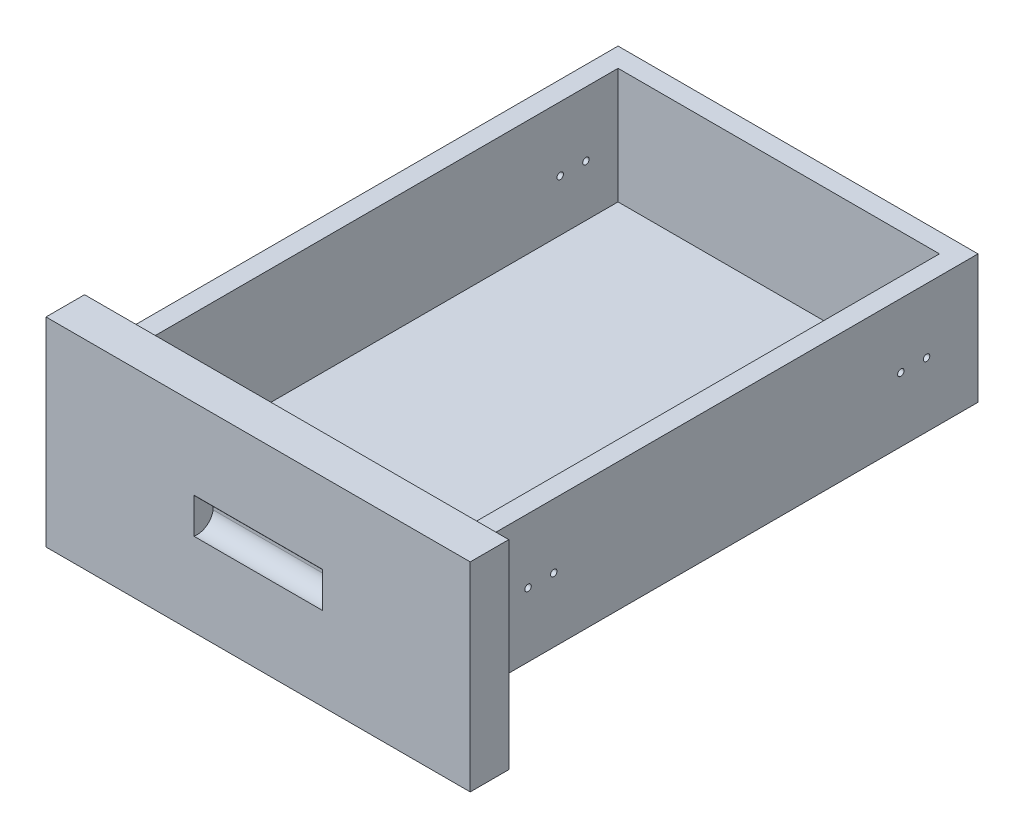
ISO-10303-21;
HEADER;
FILE_DESCRIPTION(('STEP AP214'),'2;1');
FILE_NAME('part.step','',(''),(''),'','','');
FILE_SCHEMA(('AUTOMOTIVE_DESIGN { 1 0 10303 214 1 1 1 1 }'));
ENDSEC;
DATA;
#1=APPLICATION_CONTEXT('core data for automotive mechanical design processes');
#2=APPLICATION_PROTOCOL_DEFINITION('international standard','automotive_design',2000,#1);
#3=PRODUCT_CONTEXT('',#1,'mechanical');
#4=PRODUCT('Part','Part','',(#3));
#5=PRODUCT_RELATED_PRODUCT_CATEGORY('part','',(#4));
#6=PRODUCT_DEFINITION_FORMATION('','',#4);
#7=PRODUCT_DEFINITION_CONTEXT('part definition',#1,'design');
#8=PRODUCT_DEFINITION('design','',#6,#7);
#9=PRODUCT_DEFINITION_SHAPE('','',#8);
#10=(LENGTH_UNIT() NAMED_UNIT(*) SI_UNIT(.MILLI.,.METRE.));
#11=(NAMED_UNIT(*) PLANE_ANGLE_UNIT() SI_UNIT($,.RADIAN.));
#12=(NAMED_UNIT(*) SI_UNIT($,.STERADIAN.) SOLID_ANGLE_UNIT());
#13=UNCERTAINTY_MEASURE_WITH_UNIT(LENGTH_MEASURE(1.E-05),#10,'distance_accuracy_value','');
#14=(GEOMETRIC_REPRESENTATION_CONTEXT(3) GLOBAL_UNCERTAINTY_ASSIGNED_CONTEXT((#13)) GLOBAL_UNIT_ASSIGNED_CONTEXT((#10,
#11,#12)) REPRESENTATION_CONTEXT('',''));
#15=CARTESIAN_POINT('',(0.,0.,0.));
#16=DIRECTION('',(0.,0.,1.));
#17=DIRECTION('',(1.,0.,0.));
#18=AXIS2_PLACEMENT_3D('',#15,#16,#17);
#19=CARTESIAN_POINT('',(0.,0.,0.));
#20=DIRECTION('',(0.,0.,1.));
#21=DIRECTION('',(1.,0.,0.));
#22=AXIS2_PLACEMENT_3D('',#19,#20,#21);
#23=PLANE('',#22);
#24=DIRECTION('',(0.,-1.,0.));
#25=VECTOR('',#24,1.);
#26=CARTESIAN_POINT('',(-165.,-77.5,0.));
#27=LINE('',#26,#25);
#28=CARTESIAN_POINT('',(-165.,77.5,0.));
#29=VERTEX_POINT('',#28);
#30=CARTESIAN_POINT('',(-165.,-77.5,0.));
#31=VERTEX_POINT('',#30);
#32=EDGE_CURVE('E259',#29,#31,#27,.T.);
#33=ORIENTED_EDGE('',*,*,#32,.F.);
#34=DIRECTION('',(-1.,0.,0.));
#35=VECTOR('',#34,1.);
#36=CARTESIAN_POINT('',(165.,77.5,0.));
#37=LINE('',#36,#35);
#38=CARTESIAN_POINT('',(165.,77.5,0.));
#39=VERTEX_POINT('',#38);
#40=EDGE_CURVE('E264',#39,#29,#37,.T.);
#41=ORIENTED_EDGE('',*,*,#40,.F.);
#42=DIRECTION('',(0.,1.,0.));
#43=VECTOR('',#42,1.);
#44=CARTESIAN_POINT('',(165.,-77.5,0.));
#45=LINE('',#44,#43);
#46=CARTESIAN_POINT('',(165.,-77.5,0.));
#47=VERTEX_POINT('',#46);
#48=EDGE_CURVE('E275',#47,#39,#45,.T.);
#49=ORIENTED_EDGE('',*,*,#48,.F.);
#50=DIRECTION('',(1.,0.,0.));
#51=VECTOR('',#50,1.);
#52=CARTESIAN_POINT('',(165.,-77.5,0.));
#53=LINE('',#52,#51);
#54=EDGE_CURVE('E273',#31,#47,#53,.T.);
#55=ORIENTED_EDGE('',*,*,#54,.F.);
#56=EDGE_LOOP('',(#33,#41,#49,#55));
#57=FACE_BOUND('',#56,.T.);
#58=DIRECTION('',(0.,-1.,0.));
#59=VECTOR('',#58,1.);
#60=CARTESIAN_POINT('',(140.,-37.5,0.));
#61=LINE('',#60,#59);
#62=CARTESIAN_POINT('',(140.,62.5,0.));
#63=VERTEX_POINT('',#62);
#64=CARTESIAN_POINT('',(140.,-37.5,0.));
#65=VERTEX_POINT('',#64);
#66=EDGE_CURVE('E219',#63,#65,#61,.T.);
#67=ORIENTED_EDGE('',*,*,#66,.F.);
#68=DIRECTION('',(1.,0.,0.));
#69=VECTOR('',#68,1.);
#70=CARTESIAN_POINT('',(-140.,62.5,0.));
#71=LINE('',#70,#69);
#72=CARTESIAN_POINT('',(125.,62.5,0.));
#73=VERTEX_POINT('',#72);
#74=EDGE_CURVE('E245',#73,#63,#71,.T.);
#75=ORIENTED_EDGE('',*,*,#74,.F.);
#76=DIRECTION('',(0.,1.,0.));
#77=VECTOR('',#76,1.);
#78=CARTESIAN_POINT('',(125.,-27.5,0.));
#79=LINE('',#78,#77);
#80=CARTESIAN_POINT('',(125.,-27.5,0.));
#81=VERTEX_POINT('',#80);
#82=EDGE_CURVE('E222',#81,#73,#79,.T.);
#83=ORIENTED_EDGE('',*,*,#82,.F.);
#84=DIRECTION('',(1.,0.,0.));
#85=VECTOR('',#84,1.);
#86=CARTESIAN_POINT('',(-125.,-27.5,0.));
#87=LINE('',#86,#85);
#88=CARTESIAN_POINT('',(-125.,-27.5,0.));
#89=VERTEX_POINT('',#88);
#90=EDGE_CURVE('E200',#89,#81,#87,.T.);
#91=ORIENTED_EDGE('',*,*,#90,.F.);
#92=DIRECTION('',(0.,1.,0.));
#93=VECTOR('',#92,1.);
#94=CARTESIAN_POINT('',(-125.,-27.5,0.));
#95=LINE('',#94,#93);
#96=CARTESIAN_POINT('',(-125.,62.5,0.));
#97=VERTEX_POINT('',#96);
#98=EDGE_CURVE('E210',#89,#97,#95,.T.);
#99=ORIENTED_EDGE('',*,*,#98,.T.);
#100=CARTESIAN_POINT('',(-140.,62.5,0.));
#101=VERTEX_POINT('',#100);
#102=EDGE_CURVE('E230',#101,#97,#71,.T.);
#103=ORIENTED_EDGE('',*,*,#102,.F.);
#104=DIRECTION('',(0.,1.,0.));
#105=VECTOR('',#104,1.);
#106=CARTESIAN_POINT('',(-140.,-37.5,0.));
#107=LINE('',#106,#105);
#108=CARTESIAN_POINT('',(-140.,-37.5,0.));
#109=VERTEX_POINT('',#108);
#110=EDGE_CURVE('E242',#109,#101,#107,.T.);
#111=ORIENTED_EDGE('',*,*,#110,.F.);
#112=DIRECTION('',(-1.,0.,0.));
#113=VECTOR('',#112,1.);
#114=CARTESIAN_POINT('',(-140.,-37.5,0.));
#115=LINE('',#114,#113);
#116=EDGE_CURVE('E239',#65,#109,#115,.T.);
#117=ORIENTED_EDGE('',*,*,#116,.F.);
#118=EDGE_LOOP('',(#67,#75,#83,#91,#99,#103,#111,#117));
#119=FACE_BOUND('',#118,.T.);
#120=ADVANCED_FACE('F34',(#57,#119),#23,.F.);
#121=CARTESIAN_POINT('',(-165.,-77.5,30.));
#122=DIRECTION('',(1.,0.,0.));
#123=DIRECTION('',(0.,0.,-1.));
#124=AXIS2_PLACEMENT_3D('',#121,#122,#123);
#125=PLANE('',#124);
#126=ORIENTED_EDGE('',*,*,#32,.T.);
#127=DIRECTION('',(0.,0.,-1.));
#128=VECTOR('',#127,1.);
#129=CARTESIAN_POINT('',(-165.,-77.5,30.));
#130=LINE('',#129,#128);
#131=CARTESIAN_POINT('',(-165.,-77.5,30.));
#132=VERTEX_POINT('',#131);
#133=EDGE_CURVE('E286',#132,#31,#130,.T.);
#134=ORIENTED_EDGE('',*,*,#133,.F.);
#135=DIRECTION('',(0.,-1.,0.));
#136=VECTOR('',#135,1.);
#137=CARTESIAN_POINT('',(-165.,-77.5,30.));
#138=LINE('',#137,#136);
#139=CARTESIAN_POINT('',(-165.,77.5,30.));
#140=VERTEX_POINT('',#139);
#141=EDGE_CURVE('E260',#140,#132,#138,.T.);
#142=ORIENTED_EDGE('',*,*,#141,.F.);
#143=DIRECTION('',(0.,0.,-1.));
#144=VECTOR('',#143,1.);
#145=CARTESIAN_POINT('',(-165.,77.5,30.));
#146=LINE('',#145,#144);
#147=EDGE_CURVE('E270',#140,#29,#146,.T.);
#148=ORIENTED_EDGE('',*,*,#147,.T.);
#149=EDGE_LOOP('',(#126,#134,#142,#148));
#150=FACE_BOUND('',#149,.T.);
#151=ADVANCED_FACE('F364',(#150),#125,.F.);
#152=CARTESIAN_POINT('',(165.,-77.5,30.));
#153=DIRECTION('',(0.,1.,0.));
#154=DIRECTION('',(-1.,0.,0.));
#155=AXIS2_PLACEMENT_3D('',#152,#153,#154);
#156=PLANE('',#155);
#157=ORIENTED_EDGE('',*,*,#54,.T.);
#158=DIRECTION('',(0.,0.,-1.));
#159=VECTOR('',#158,1.);
#160=CARTESIAN_POINT('',(165.,-77.5,30.));
#161=LINE('',#160,#159);
#162=CARTESIAN_POINT('',(165.,-77.5,30.));
#163=VERTEX_POINT('',#162);
#164=EDGE_CURVE('E283',#163,#47,#161,.T.);
#165=ORIENTED_EDGE('',*,*,#164,.F.);
#166=DIRECTION('',(1.,0.,0.));
#167=VECTOR('',#166,1.);
#168=CARTESIAN_POINT('',(165.,-77.5,30.));
#169=LINE('',#168,#167);
#170=EDGE_CURVE('E263',#132,#163,#169,.T.);
#171=ORIENTED_EDGE('',*,*,#170,.F.);
#172=ORIENTED_EDGE('',*,*,#133,.T.);
#173=EDGE_LOOP('',(#157,#165,#171,#172));
#174=FACE_BOUND('',#173,.T.);
#175=ADVANCED_FACE('F370',(#174),#156,.F.);
#176=CARTESIAN_POINT('',(165.,-77.5,30.));
#177=DIRECTION('',(-1.,0.,0.));
#178=DIRECTION('',(0.,0.,1.));
#179=AXIS2_PLACEMENT_3D('',#176,#177,#178);
#180=PLANE('',#179);
#181=ORIENTED_EDGE('',*,*,#48,.T.);
#182=DIRECTION('',(0.,0.,-1.));
#183=VECTOR('',#182,1.);
#184=CARTESIAN_POINT('',(165.,77.5,30.));
#185=LINE('',#184,#183);
#186=CARTESIAN_POINT('',(165.,77.5,30.));
#187=VERTEX_POINT('',#186);
#188=EDGE_CURVE('E280',#187,#39,#185,.T.);
#189=ORIENTED_EDGE('',*,*,#188,.F.);
#190=DIRECTION('',(0.,1.,0.));
#191=VECTOR('',#190,1.);
#192=CARTESIAN_POINT('',(165.,-77.5,30.));
#193=LINE('',#192,#191);
#194=EDGE_CURVE('E266',#163,#187,#193,.T.);
#195=ORIENTED_EDGE('',*,*,#194,.F.);
#196=ORIENTED_EDGE('',*,*,#164,.T.);
#197=EDGE_LOOP('',(#181,#189,#195,#196));
#198=FACE_BOUND('',#197,.T.);
#199=ADVANCED_FACE('F380',(#198),#180,.F.);
#200=CARTESIAN_POINT('',(165.,77.5,30.));
#201=DIRECTION('',(0.,-1.,0.));
#202=DIRECTION('',(1.,0.,0.));
#203=AXIS2_PLACEMENT_3D('',#200,#201,#202);
#204=PLANE('',#203);
#205=ORIENTED_EDGE('',*,*,#40,.T.);
#206=ORIENTED_EDGE('',*,*,#147,.F.);
#207=DIRECTION('',(-1.,0.,0.));
#208=VECTOR('',#207,1.);
#209=CARTESIAN_POINT('',(165.,77.5,30.));
#210=LINE('',#209,#208);
#211=EDGE_CURVE('E268',#187,#140,#210,.T.);
#212=ORIENTED_EDGE('',*,*,#211,.F.);
#213=ORIENTED_EDGE('',*,*,#188,.T.);
#214=EDGE_LOOP('',(#205,#206,#212,#213));
#215=FACE_BOUND('',#214,.T.);
#216=ADVANCED_FACE('F377',(#215),#204,.F.);
#217=CARTESIAN_POINT('',(0.,0.,30.));
#218=DIRECTION('',(0.,0.,1.));
#219=DIRECTION('',(1.,0.,0.));
#220=AXIS2_PLACEMENT_3D('',#217,#218,#219);
#221=PLANE('',#220);
#222=DIRECTION('',(1.,0.,0.));
#223=VECTOR('',#222,1.);
#224=CARTESIAN_POINT('',(0.,15.0778477436762,30.));
#225=LINE('',#224,#223);
#226=CARTESIAN_POINT('',(-50.,15.0778477436762,30.));
#227=VERTEX_POINT('',#226);
#228=CARTESIAN_POINT('',(50.,15.0778477436762,30.));
#229=VERTEX_POINT('',#228);
#230=EDGE_CURVE('E297',#227,#229,#225,.T.);
#231=ORIENTED_EDGE('',*,*,#230,.T.);
#232=DIRECTION('',(0.,-1.,0.));
#233=VECTOR('',#232,1.);
#234=CARTESIAN_POINT('',(50.,0.,30.));
#235=LINE('',#234,#233);
#236=CARTESIAN_POINT('',(50.,-12.6984706511995,30.));
#237=VERTEX_POINT('',#236);
#238=EDGE_CURVE('E289',#229,#237,#235,.T.);
#239=ORIENTED_EDGE('',*,*,#238,.T.);
#240=DIRECTION('',(1.,0.,0.));
#241=VECTOR('',#240,1.);
#242=CARTESIAN_POINT('',(-50.,-12.6984706511995,30.));
#243=LINE('',#242,#241);
#244=CARTESIAN_POINT('',(-50.,-12.6984706511995,30.));
#245=VERTEX_POINT('',#244);
#246=EDGE_CURVE('E292',#237,#245,#243,.F.);
#247=ORIENTED_EDGE('',*,*,#246,.T.);
#248=DIRECTION('',(0.,-1.,0.));
#249=VECTOR('',#248,1.);
#250=CARTESIAN_POINT('',(-50.,0.,30.));
#251=LINE('',#250,#249);
#252=EDGE_CURVE('E295',#227,#245,#251,.T.);
#253=ORIENTED_EDGE('',*,*,#252,.F.);
#254=EDGE_LOOP('',(#231,#239,#247,#253));
#255=FACE_BOUND('',#254,.T.);
#256=ORIENTED_EDGE('',*,*,#141,.T.);
#257=ORIENTED_EDGE('',*,*,#170,.T.);
#258=ORIENTED_EDGE('',*,*,#194,.T.);
#259=ORIENTED_EDGE('',*,*,#211,.T.);
#260=EDGE_LOOP('',(#256,#257,#258,#259));
#261=FACE_BOUND('',#260,.T.);
#262=ADVANCED_FACE('F348',(#255,#261),#221,.T.);
#263=CARTESIAN_POINT('',(140.,-37.5,-390.));
#264=DIRECTION('',(-1.,0.,0.));
#265=DIRECTION('',(0.,0.,1.));
#266=AXIS2_PLACEMENT_3D('',#263,#264,#265);
#267=PLANE('',#266);
#268=CARTESIAN_POINT('',(140.,12.5,-330.));
#269=DIRECTION('',(1.,0.,0.));
#270=DIRECTION('',(0.,0.,-1.));
#271=AXIS2_PLACEMENT_3D('',#268,#269,#270);
#272=CIRCLE('',#271,2.50000000000002);
#273=CARTESIAN_POINT('',(140.,12.5,-332.5));
#274=VERTEX_POINT('',#273);
#275=EDGE_CURVE('E310',#274,#274,#272,.T.);
#276=ORIENTED_EDGE('',*,*,#275,.F.);
#277=EDGE_LOOP('',(#276));
#278=FACE_BOUND('',#277,.T.);
#279=CARTESIAN_POINT('',(140.,12.5,-60.));
#280=DIRECTION('',(1.,0.,0.));
#281=DIRECTION('',(0.,0.,1.));
#282=AXIS2_PLACEMENT_3D('',#279,#280,#281);
#283=CIRCLE('',#282,2.50000000000002);
#284=CARTESIAN_POINT('',(140.,12.5,-57.5));
#285=VERTEX_POINT('',#284);
#286=EDGE_CURVE('E517',#285,#285,#283,.T.);
#287=ORIENTED_EDGE('',*,*,#286,.F.);
#288=EDGE_LOOP('',(#287));
#289=FACE_BOUND('',#288,.T.);
#290=CARTESIAN_POINT('',(140.,12.5,-40.));
#291=DIRECTION('',(1.,0.,0.));
#292=DIRECTION('',(0.,0.,1.));
#293=AXIS2_PLACEMENT_3D('',#290,#291,#292);
#294=CIRCLE('',#293,2.50000000000002);
#295=CARTESIAN_POINT('',(140.,12.5,-37.5));
#296=VERTEX_POINT('',#295);
#297=EDGE_CURVE('E515',#296,#296,#294,.T.);
#298=ORIENTED_EDGE('',*,*,#297,.F.);
#299=EDGE_LOOP('',(#298));
#300=FACE_BOUND('',#299,.T.);
#301=CARTESIAN_POINT('',(140.,12.5,-350.));
#302=DIRECTION('',(1.,0.,0.));
#303=DIRECTION('',(0.,0.,-1.));
#304=AXIS2_PLACEMENT_3D('',#301,#302,#303);
#305=CIRCLE('',#304,2.50000000000002);
#306=CARTESIAN_POINT('',(140.,12.5,-352.5));
#307=VERTEX_POINT('',#306);
#308=EDGE_CURVE('E306',#307,#307,#305,.T.);
#309=ORIENTED_EDGE('',*,*,#308,.F.);
#310=EDGE_LOOP('',(#309));
#311=FACE_BOUND('',#310,.T.);
#312=ORIENTED_EDGE('',*,*,#66,.T.);
#313=DIRECTION('',(0.,0.,1.));
#314=VECTOR('',#313,1.);
#315=CARTESIAN_POINT('',(140.,-37.5,-390.));
#316=LINE('',#315,#314);
#317=CARTESIAN_POINT('',(140.,-37.5,-390.));
#318=VERTEX_POINT('',#317);
#319=EDGE_CURVE('E256',#318,#65,#316,.T.);
#320=ORIENTED_EDGE('',*,*,#319,.F.);
#321=DIRECTION('',(0.,-1.,0.));
#322=VECTOR('',#321,1.);
#323=CARTESIAN_POINT('',(140.,-37.5,-390.));
#324=LINE('',#323,#322);
#325=CARTESIAN_POINT('',(140.,62.5,-390.));
#326=VERTEX_POINT('',#325);
#327=EDGE_CURVE('E226',#326,#318,#324,.T.);
#328=ORIENTED_EDGE('',*,*,#327,.F.);
#329=DIRECTION('',(0.,0.,1.));
#330=VECTOR('',#329,1.);
#331=CARTESIAN_POINT('',(140.,62.5,-390.));
#332=LINE('',#331,#330);
#333=EDGE_CURVE('E236',#326,#63,#332,.T.);
#334=ORIENTED_EDGE('',*,*,#333,.T.);
#335=EDGE_LOOP('',(#312,#320,#328,#334));
#336=FACE_BOUND('',#335,.T.);
#337=ADVANCED_FACE('F399',(#278,#289,#300,#311,#336),#267,.F.);
#338=CARTESIAN_POINT('',(-140.,-37.5,-390.));
#339=DIRECTION('',(0.,1.,0.));
#340=DIRECTION('',(0.,0.,1.));
#341=AXIS2_PLACEMENT_3D('',#338,#339,#340);
#342=PLANE('',#341);
#343=ORIENTED_EDGE('',*,*,#116,.T.);
#344=DIRECTION('',(0.,0.,1.));
#345=VECTOR('',#344,1.);
#346=CARTESIAN_POINT('',(-140.,-37.5,-390.));
#347=LINE('',#346,#345);
#348=CARTESIAN_POINT('',(-140.,-37.5,-390.));
#349=VERTEX_POINT('',#348);
#350=EDGE_CURVE('E253',#349,#109,#347,.T.);
#351=ORIENTED_EDGE('',*,*,#350,.F.);
#352=DIRECTION('',(-1.,0.,0.));
#353=VECTOR('',#352,1.);
#354=CARTESIAN_POINT('',(-140.,-37.5,-390.));
#355=LINE('',#354,#353);
#356=EDGE_CURVE('E229',#318,#349,#355,.T.);
#357=ORIENTED_EDGE('',*,*,#356,.F.);
#358=ORIENTED_EDGE('',*,*,#319,.T.);
#359=EDGE_LOOP('',(#343,#351,#357,#358));
#360=FACE_BOUND('',#359,.T.);
#361=ADVANCED_FACE('F403',(#360),#342,.F.);
#362=CARTESIAN_POINT('',(-140.,-37.5,-390.));
#363=DIRECTION('',(1.,0.,0.));
#364=DIRECTION('',(0.,0.,-1.));
#365=AXIS2_PLACEMENT_3D('',#362,#363,#364);
#366=PLANE('',#365);
#367=CARTESIAN_POINT('',(-140.,12.5,-330.));
#368=DIRECTION('',(1.,0.,0.));
#369=DIRECTION('',(0.,0.,-1.));
#370=AXIS2_PLACEMENT_3D('',#367,#368,#369);
#371=CIRCLE('',#370,2.50000000000002);
#372=CARTESIAN_POINT('',(-140.,12.5,-332.5));
#373=VERTEX_POINT('',#372);
#374=EDGE_CURVE('E333',#373,#373,#371,.T.);
#375=ORIENTED_EDGE('',*,*,#374,.T.);
#376=EDGE_LOOP('',(#375));
#377=FACE_BOUND('',#376,.T.);
#378=CARTESIAN_POINT('',(-140.,12.5,-60.));
#379=DIRECTION('',(1.,0.,0.));
#380=DIRECTION('',(0.,0.,-1.));
#381=AXIS2_PLACEMENT_3D('',#378,#379,#380);
#382=CIRCLE('',#381,2.50000000000002);
#383=CARTESIAN_POINT('',(-140.,12.5,-62.5));
#384=VERTEX_POINT('',#383);
#385=EDGE_CURVE('E318',#384,#384,#382,.T.);
#386=ORIENTED_EDGE('',*,*,#385,.T.);
#387=EDGE_LOOP('',(#386));
#388=FACE_BOUND('',#387,.T.);
#389=CARTESIAN_POINT('',(-140.,12.5,-40.));
#390=DIRECTION('',(1.,0.,0.));
#391=DIRECTION('',(0.,0.,-1.));
#392=AXIS2_PLACEMENT_3D('',#389,#390,#391);
#393=CIRCLE('',#392,2.50000000000002);
#394=CARTESIAN_POINT('',(-140.,12.5,-42.5));
#395=VERTEX_POINT('',#394);
#396=EDGE_CURVE('E314',#395,#395,#393,.T.);
#397=ORIENTED_EDGE('',*,*,#396,.T.);
#398=EDGE_LOOP('',(#397));
#399=FACE_BOUND('',#398,.T.);
#400=CARTESIAN_POINT('',(-140.,12.5,-350.));
#401=DIRECTION('',(1.,0.,0.));
#402=DIRECTION('',(0.,0.,-1.));
#403=AXIS2_PLACEMENT_3D('',#400,#401,#402);
#404=CIRCLE('',#403,2.50000000000002);
#405=CARTESIAN_POINT('',(-140.,12.5,-352.5));
#406=VERTEX_POINT('',#405);
#407=EDGE_CURVE('E189',#406,#406,#404,.T.);
#408=ORIENTED_EDGE('',*,*,#407,.T.);
#409=EDGE_LOOP('',(#408));
#410=FACE_BOUND('',#409,.T.);
#411=ORIENTED_EDGE('',*,*,#110,.T.);
#412=DIRECTION('',(0.,0.,1.));
#413=VECTOR('',#412,1.);
#414=CARTESIAN_POINT('',(-140.,62.5,-390.));
#415=LINE('',#414,#413);
#416=CARTESIAN_POINT('',(-140.,62.5,-390.));
#417=VERTEX_POINT('',#416);
#418=EDGE_CURVE('E250',#417,#101,#415,.T.);
#419=ORIENTED_EDGE('',*,*,#418,.F.);
#420=DIRECTION('',(0.,1.,0.));
#421=VECTOR('',#420,1.);
#422=CARTESIAN_POINT('',(-140.,-37.5,-390.));
#423=LINE('',#422,#421);
#424=EDGE_CURVE('E232',#349,#417,#423,.T.);
#425=ORIENTED_EDGE('',*,*,#424,.F.);
#426=ORIENTED_EDGE('',*,*,#350,.T.);
#427=EDGE_LOOP('',(#411,#419,#425,#426));
#428=FACE_BOUND('',#427,.T.);
#429=ADVANCED_FACE('F408',(#377,#388,#399,#410,#428),#366,.F.);
#430=CARTESIAN_POINT('',(-140.,62.5,-390.));
#431=DIRECTION('',(0.,-1.,0.));
#432=DIRECTION('',(0.,0.,-1.));
#433=AXIS2_PLACEMENT_3D('',#430,#431,#432);
#434=PLANE('',#433);
#435=ORIENTED_EDGE('',*,*,#102,.T.);
#436=DIRECTION('',(0.,0.,1.));
#437=VECTOR('',#436,1.);
#438=CARTESIAN_POINT('',(-125.,62.5,0.));
#439=LINE('',#438,#437);
#440=CARTESIAN_POINT('',(-125.,62.5,-375.));
#441=VERTEX_POINT('',#440);
#442=EDGE_CURVE('E174',#441,#97,#439,.T.);
#443=ORIENTED_EDGE('',*,*,#442,.F.);
#444=DIRECTION('',(-1.,0.,0.));
#445=VECTOR('',#444,1.);
#446=CARTESIAN_POINT('',(-125.,62.5,-375.));
#447=LINE('',#446,#445);
#448=CARTESIAN_POINT('',(125.,62.5,-375.));
#449=VERTEX_POINT('',#448);
#450=EDGE_CURVE('E201',#449,#441,#447,.T.);
#451=ORIENTED_EDGE('',*,*,#450,.F.);
#452=DIRECTION('',(0.,0.,-1.));
#453=VECTOR('',#452,1.);
#454=CARTESIAN_POINT('',(125.,62.5,0.));
#455=LINE('',#454,#453);
#456=EDGE_CURVE('E212',#73,#449,#455,.T.);
#457=ORIENTED_EDGE('',*,*,#456,.F.);
#458=ORIENTED_EDGE('',*,*,#74,.T.);
#459=ORIENTED_EDGE('',*,*,#333,.F.);
#460=DIRECTION('',(1.,0.,0.));
#461=VECTOR('',#460,1.);
#462=CARTESIAN_POINT('',(-140.,62.5,-390.));
#463=LINE('',#462,#461);
#464=EDGE_CURVE('E234',#417,#326,#463,.T.);
#465=ORIENTED_EDGE('',*,*,#464,.F.);
#466=ORIENTED_EDGE('',*,*,#418,.T.);
#467=EDGE_LOOP('',(#435,#443,#451,#457,#458,#459,#465,#466));
#468=FACE_BOUND('',#467,.T.);
#469=ADVANCED_FACE('F416',(#468),#434,.F.);
#470=CARTESIAN_POINT('',(0.,0.,-390.));
#471=DIRECTION('',(0.,0.,-1.));
#472=DIRECTION('',(-1.,0.,0.));
#473=AXIS2_PLACEMENT_3D('',#470,#471,#472);
#474=PLANE('',#473);
#475=ORIENTED_EDGE('',*,*,#327,.T.);
#476=ORIENTED_EDGE('',*,*,#356,.T.);
#477=ORIENTED_EDGE('',*,*,#424,.T.);
#478=ORIENTED_EDGE('',*,*,#464,.T.);
#479=EDGE_LOOP('',(#475,#476,#477,#478));
#480=FACE_BOUND('',#479,.T.);
#481=ADVANCED_FACE('F420',(#480),#474,.T.);
#482=CARTESIAN_POINT('',(-125.,-27.5,0.));
#483=DIRECTION('',(-1.,0.,0.));
#484=DIRECTION('',(0.,0.,1.));
#485=AXIS2_PLACEMENT_3D('',#482,#483,#484);
#486=PLANE('',#485);
#487=CARTESIAN_POINT('',(-125.,12.5,-330.));
#488=DIRECTION('',(-1.,0.,0.));
#489=DIRECTION('',(0.,0.,1.));
#490=AXIS2_PLACEMENT_3D('',#487,#488,#489);
#491=CIRCLE('',#490,2.50000000000002);
#492=CARTESIAN_POINT('',(-125.,12.5,-327.5));
#493=VERTEX_POINT('',#492);
#494=EDGE_CURVE('E330',#493,#493,#491,.T.);
#495=ORIENTED_EDGE('',*,*,#494,.T.);
#496=EDGE_LOOP('',(#495));
#497=FACE_BOUND('',#496,.T.);
#498=CARTESIAN_POINT('',(-125.,12.5,-60.));
#499=DIRECTION('',(-1.,0.,0.));
#500=DIRECTION('',(0.,0.,1.));
#501=AXIS2_PLACEMENT_3D('',#498,#499,#500);
#502=CIRCLE('',#501,2.50000000000002);
#503=CARTESIAN_POINT('',(-125.,12.5,-57.5));
#504=VERTEX_POINT('',#503);
#505=EDGE_CURVE('E313',#504,#504,#502,.T.);
#506=ORIENTED_EDGE('',*,*,#505,.T.);
#507=EDGE_LOOP('',(#506));
#508=FACE_BOUND('',#507,.T.);
#509=CARTESIAN_POINT('',(-125.,12.5,-40.));
#510=DIRECTION('',(-1.,0.,0.));
#511=DIRECTION('',(0.,0.,1.));
#512=AXIS2_PLACEMENT_3D('',#509,#510,#511);
#513=CIRCLE('',#512,2.50000000000002);
#514=CARTESIAN_POINT('',(-125.,12.5,-37.5));
#515=VERTEX_POINT('',#514);
#516=EDGE_CURVE('E309',#515,#515,#513,.T.);
#517=ORIENTED_EDGE('',*,*,#516,.T.);
#518=EDGE_LOOP('',(#517));
#519=FACE_BOUND('',#518,.T.);
#520=CARTESIAN_POINT('',(-125.,12.5,-350.));
#521=DIRECTION('',(-1.,0.,0.));
#522=DIRECTION('',(0.,0.,1.));
#523=AXIS2_PLACEMENT_3D('',#520,#521,#522);
#524=CIRCLE('',#523,2.50000000000002);
#525=CARTESIAN_POINT('',(-125.,12.5,-347.5));
#526=VERTEX_POINT('',#525);
#527=EDGE_CURVE('E305',#526,#526,#524,.T.);
#528=ORIENTED_EDGE('',*,*,#527,.T.);
#529=EDGE_LOOP('',(#528));
#530=FACE_BOUND('',#529,.T.);
#531=ORIENTED_EDGE('',*,*,#442,.T.);
#532=ORIENTED_EDGE('',*,*,#98,.F.);
#533=DIRECTION('',(0.,0.,1.));
#534=VECTOR('',#533,1.);
#535=CARTESIAN_POINT('',(-125.,-27.5,0.));
#536=LINE('',#535,#534);
#537=CARTESIAN_POINT('',(-125.,-27.5,-375.));
#538=VERTEX_POINT('',#537);
#539=EDGE_CURVE('E197',#538,#89,#536,.T.);
#540=ORIENTED_EDGE('',*,*,#539,.F.);
#541=DIRECTION('',(0.,1.,0.));
#542=VECTOR('',#541,1.);
#543=CARTESIAN_POINT('',(-125.,-27.5,-375.));
#544=LINE('',#543,#542);
#545=EDGE_CURVE('E217',#538,#441,#544,.T.);
#546=ORIENTED_EDGE('',*,*,#545,.T.);
#547=EDGE_LOOP('',(#531,#532,#540,#546));
#548=FACE_BOUND('',#547,.T.);
#549=ADVANCED_FACE('F424',(#497,#508,#519,#530,#548),#486,.F.);
#550=CARTESIAN_POINT('',(-125.,-27.5,-375.));
#551=DIRECTION('',(0.,0.,-1.));
#552=DIRECTION('',(-1.,0.,0.));
#553=AXIS2_PLACEMENT_3D('',#550,#551,#552);
#554=PLANE('',#553);
#555=ORIENTED_EDGE('',*,*,#450,.T.);
#556=ORIENTED_EDGE('',*,*,#545,.F.);
#557=DIRECTION('',(-1.,0.,0.));
#558=VECTOR('',#557,1.);
#559=CARTESIAN_POINT('',(-125.,-27.5,-375.));
#560=LINE('',#559,#558);
#561=CARTESIAN_POINT('',(125.,-27.5,-375.));
#562=VERTEX_POINT('',#561);
#563=EDGE_CURVE('E207',#562,#538,#560,.T.);
#564=ORIENTED_EDGE('',*,*,#563,.F.);
#565=DIRECTION('',(0.,1.,0.));
#566=VECTOR('',#565,1.);
#567=CARTESIAN_POINT('',(125.,-27.5,-375.));
#568=LINE('',#567,#566);
#569=EDGE_CURVE('E220',#562,#449,#568,.T.);
#570=ORIENTED_EDGE('',*,*,#569,.T.);
#571=EDGE_LOOP('',(#555,#556,#564,#570));
#572=FACE_BOUND('',#571,.T.);
#573=ADVANCED_FACE('F428',(#572),#554,.F.);
#574=CARTESIAN_POINT('',(125.,-27.5,0.));
#575=DIRECTION('',(1.,0.,0.));
#576=DIRECTION('',(0.,0.,-1.));
#577=AXIS2_PLACEMENT_3D('',#574,#575,#576);
#578=PLANE('',#577);
#579=CARTESIAN_POINT('',(125.,12.5,-330.));
#580=DIRECTION('',(1.,0.,0.));
#581=DIRECTION('',(0.,0.,-1.));
#582=AXIS2_PLACEMENT_3D('',#579,#580,#581);
#583=CIRCLE('',#582,2.50000000000002);
#584=CARTESIAN_POINT('',(125.,12.5,-332.5));
#585=VERTEX_POINT('',#584);
#586=EDGE_CURVE('E38',#585,#585,#583,.T.);
#587=ORIENTED_EDGE('',*,*,#586,.T.);
#588=EDGE_LOOP('',(#587));
#589=FACE_BOUND('',#588,.T.);
#590=CARTESIAN_POINT('',(125.,12.5,-60.));
#591=DIRECTION('',(1.,0.,0.));
#592=DIRECTION('',(0.,0.,-1.));
#593=AXIS2_PLACEMENT_3D('',#590,#591,#592);
#594=CIRCLE('',#593,2.50000000000002);
#595=CARTESIAN_POINT('',(125.,12.5,-62.5));
#596=VERTEX_POINT('',#595);
#597=EDGE_CURVE('E311',#596,#596,#594,.T.);
#598=ORIENTED_EDGE('',*,*,#597,.T.);
#599=EDGE_LOOP('',(#598));
#600=FACE_BOUND('',#599,.T.);
#601=CARTESIAN_POINT('',(125.,12.5,-40.));
#602=DIRECTION('',(1.,0.,0.));
#603=DIRECTION('',(0.,0.,-1.));
#604=AXIS2_PLACEMENT_3D('',#601,#602,#603);
#605=CIRCLE('',#604,2.50000000000002);
#606=CARTESIAN_POINT('',(125.,12.5,-42.5));
#607=VERTEX_POINT('',#606);
#608=EDGE_CURVE('E307',#607,#607,#605,.T.);
#609=ORIENTED_EDGE('',*,*,#608,.T.);
#610=EDGE_LOOP('',(#609));
#611=FACE_BOUND('',#610,.T.);
#612=CARTESIAN_POINT('',(125.,12.5,-350.));
#613=DIRECTION('',(1.,0.,0.));
#614=DIRECTION('',(0.,0.,-1.));
#615=AXIS2_PLACEMENT_3D('',#612,#613,#614);
#616=CIRCLE('',#615,2.50000000000002);
#617=CARTESIAN_POINT('',(125.,12.5,-352.5));
#618=VERTEX_POINT('',#617);
#619=EDGE_CURVE('E302',#618,#618,#616,.T.);
#620=ORIENTED_EDGE('',*,*,#619,.T.);
#621=EDGE_LOOP('',(#620));
#622=FACE_BOUND('',#621,.T.);
#623=ORIENTED_EDGE('',*,*,#456,.T.);
#624=ORIENTED_EDGE('',*,*,#569,.F.);
#625=DIRECTION('',(0.,0.,-1.));
#626=VECTOR('',#625,1.);
#627=CARTESIAN_POINT('',(125.,-27.5,0.));
#628=LINE('',#627,#626);
#629=EDGE_CURVE('E204',#81,#562,#628,.T.);
#630=ORIENTED_EDGE('',*,*,#629,.F.);
#631=ORIENTED_EDGE('',*,*,#82,.T.);
#632=EDGE_LOOP('',(#623,#624,#630,#631));
#633=FACE_BOUND('',#632,.T.);
#634=ADVANCED_FACE('F430',(#589,#600,#611,#622,#633),#578,.F.);
#635=CARTESIAN_POINT('',(0.,-27.5,0.));
#636=DIRECTION('',(0.,-1.,0.));
#637=DIRECTION('',(0.,0.,-1.));
#638=AXIS2_PLACEMENT_3D('',#635,#636,#637);
#639=PLANE('',#638);
#640=ORIENTED_EDGE('',*,*,#539,.T.);
#641=ORIENTED_EDGE('',*,*,#90,.T.);
#642=ORIENTED_EDGE('',*,*,#629,.T.);
#643=ORIENTED_EDGE('',*,*,#563,.T.);
#644=EDGE_LOOP('',(#640,#641,#642,#643));
#645=FACE_BOUND('',#644,.T.);
#646=ADVANCED_FACE('F433',(#645),#639,.F.);
#647=CARTESIAN_POINT('',(-50.,-0.485513133251093,27.3366057999636));
#648=DIRECTION('',(1.,0.,0.));
#649=DIRECTION('',(0.,0.,-1.));
#650=AXIS2_PLACEMENT_3D('',#647,#648,#649);
#651=CYLINDRICAL_SURFACE('',#650,12.5);
#652=CARTESIAN_POINT('',(50.,-0.485513133251093,27.3366057999636));
#653=DIRECTION('',(-1.,0.,0.));
#654=DIRECTION('',(0.,0.,1.));
#655=AXIS2_PLACEMENT_3D('',#652,#653,#654);
#656=CIRCLE('',#655,12.5);
#657=CARTESIAN_POINT('',(50.,-2.49999999999997,15.));
#658=VERTEX_POINT('',#657);
#659=EDGE_CURVE('E186',#658,#237,#656,.T.);
#660=ORIENTED_EDGE('',*,*,#659,.F.);
#661=DIRECTION('',(1.,0.,0.));
#662=VECTOR('',#661,1.);
#663=CARTESIAN_POINT('',(-50.,-2.49999999999997,15.));
#664=LINE('',#663,#662);
#665=CARTESIAN_POINT('',(-50.,-2.49999999999997,15.));
#666=VERTEX_POINT('',#665);
#667=EDGE_CURVE('E182',#666,#658,#664,.T.);
#668=ORIENTED_EDGE('',*,*,#667,.F.);
#669=CARTESIAN_POINT('',(-50.,-0.485513133251093,27.3366057999636));
#670=DIRECTION('',(-1.,0.,0.));
#671=DIRECTION('',(0.,0.,1.));
#672=AXIS2_PLACEMENT_3D('',#669,#670,#671);
#673=CIRCLE('',#672,12.5);
#674=EDGE_CURVE('E167',#666,#245,#673,.T.);
#675=ORIENTED_EDGE('',*,*,#674,.T.);
#676=ORIENTED_EDGE('',*,*,#246,.F.);
#677=EDGE_LOOP('',(#660,#668,#675,#676));
#678=FACE_BOUND('',#677,.T.);
#679=ADVANCED_FACE('F346',(#678),#651,.F.);
#680=CARTESIAN_POINT('',(-50.,8.79105027608436,35.7148735990125));
#681=DIRECTION('',(0.,-0.742125072746837,-0.670261423923906));
#682=DIRECTION('',(0.,0.670261423923906,-0.742125072746837));
#683=AXIS2_PLACEMENT_3D('',#680,#681,#682);
#684=PLANE('',#683);
#685=DIRECTION('',(0.,0.670261423923906,-0.742125072746837));
#686=VECTOR('',#685,1.);
#687=CARTESIAN_POINT('',(50.,8.79105027608436,35.7148735990125));
#688=LINE('',#687,#686);
#689=CARTESIAN_POINT('',(50.,14.7067852073027,29.164869288038));
#690=VERTEX_POINT('',#689);
#691=CARTESIAN_POINT('',(50.,19.9573913384927,23.3513071196195));
#692=VERTEX_POINT('',#691);
#693=EDGE_CURVE('E188',#690,#692,#688,.T.);
#694=ORIENTED_EDGE('',*,*,#693,.F.);
#695=DIRECTION('',(1.,0.,0.));
#696=VECTOR('',#695,1.);
#697=CARTESIAN_POINT('',(-50.,14.7067852073027,29.164869288038));
#698=LINE('',#697,#696);
#699=CARTESIAN_POINT('',(-50.,14.7067852073027,29.164869288038));
#700=VERTEX_POINT('',#699);
#701=EDGE_CURVE('E57',#690,#700,#698,.F.);
#702=ORIENTED_EDGE('',*,*,#701,.T.);
#703=DIRECTION('',(0.,0.670261423923906,-0.742125072746837));
#704=VECTOR('',#703,1.);
#705=CARTESIAN_POINT('',(-50.,8.79105027608436,35.7148735990125));
#706=LINE('',#705,#704);
#707=CARTESIAN_POINT('',(-50.,19.9573913384927,23.3513071196195));
#708=VERTEX_POINT('',#707);
#709=EDGE_CURVE('E158',#700,#708,#706,.T.);
#710=ORIENTED_EDGE('',*,*,#709,.T.);
#711=DIRECTION('',(1.,0.,0.));
#712=VECTOR('',#711,1.);
#713=CARTESIAN_POINT('',(-50.,19.9573913384927,23.3513071196195));
#714=LINE('',#713,#712);
#715=EDGE_CURVE('E161',#708,#692,#714,.T.);
#716=ORIENTED_EDGE('',*,*,#715,.T.);
#717=EDGE_LOOP('',(#694,#702,#710,#716));
#718=FACE_BOUND('',#717,.T.);
#719=ADVANCED_FACE('F160',(#718),#684,.T.);
#720=CARTESIAN_POINT('',(-50.,16.2467659747585,20.));
#721=DIRECTION('',(1.,0.,0.));
#722=DIRECTION('',(0.,0.,-1.));
#723=AXIS2_PLACEMENT_3D('',#720,#721,#722);
#724=CYLINDRICAL_SURFACE('',#723,5.);
#725=CARTESIAN_POINT('',(50.,16.2467659747585,20.));
#726=DIRECTION('',(-1.,0.,0.));
#727=DIRECTION('',(0.,0.,1.));
#728=AXIS2_PLACEMENT_3D('',#725,#726,#727);
#729=CIRCLE('',#728,5.);
#730=CARTESIAN_POINT('',(50.,16.2467659747585,15.));
#731=VERTEX_POINT('',#730);
#732=EDGE_CURVE('E173',#692,#731,#729,.T.);
#733=ORIENTED_EDGE('',*,*,#732,.F.);
#734=ORIENTED_EDGE('',*,*,#715,.F.);
#735=CARTESIAN_POINT('',(-50.,16.2467659747585,20.));
#736=DIRECTION('',(-1.,0.,0.));
#737=DIRECTION('',(0.,0.,1.));
#738=AXIS2_PLACEMENT_3D('',#735,#736,#737);
#739=CIRCLE('',#738,5.);
#740=CARTESIAN_POINT('',(-50.,16.2467659747585,15.));
#741=VERTEX_POINT('',#740);
#742=EDGE_CURVE('E166',#708,#741,#739,.T.);
#743=ORIENTED_EDGE('',*,*,#742,.T.);
#744=DIRECTION('',(1.,0.,0.));
#745=VECTOR('',#744,1.);
#746=CARTESIAN_POINT('',(-50.,16.2467659747585,15.));
#747=LINE('',#746,#745);
#748=EDGE_CURVE('E175',#741,#731,#747,.T.);
#749=ORIENTED_EDGE('',*,*,#748,.T.);
#750=EDGE_LOOP('',(#733,#734,#743,#749));
#751=FACE_BOUND('',#750,.T.);
#752=ADVANCED_FACE('F170',(#751),#724,.F.);
#753=CARTESIAN_POINT('',(-50.,16.2467659747585,15.));
#754=DIRECTION('',(0.,0.,1.));
#755=DIRECTION('',(0.,-1.,0.));
#756=AXIS2_PLACEMENT_3D('',#753,#754,#755);
#757=PLANE('',#756);
#758=DIRECTION('',(0.,-1.,0.));
#759=VECTOR('',#758,1.);
#760=CARTESIAN_POINT('',(50.,16.2467659747585,15.));
#761=LINE('',#760,#759);
#762=EDGE_CURVE('E192',#731,#658,#761,.T.);
#763=ORIENTED_EDGE('',*,*,#762,.F.);
#764=ORIENTED_EDGE('',*,*,#748,.F.);
#765=DIRECTION('',(0.,-1.,0.));
#766=VECTOR('',#765,1.);
#767=CARTESIAN_POINT('',(-50.,16.2467659747585,15.));
#768=LINE('',#767,#766);
#769=EDGE_CURVE('E180',#741,#666,#768,.T.);
#770=ORIENTED_EDGE('',*,*,#769,.T.);
#771=ORIENTED_EDGE('',*,*,#667,.T.);
#772=EDGE_LOOP('',(#763,#764,#770,#771));
#773=FACE_BOUND('',#772,.T.);
#774=ADVANCED_FACE('F447',(#773),#757,.T.);
#775=CARTESIAN_POINT('',(-50.,-0.485513133251093,27.3366057999636));
#776=DIRECTION('',(-1.,0.,0.));
#777=DIRECTION('',(0.,0.,1.));
#778=AXIS2_PLACEMENT_3D('',#775,#776,#777);
#779=PLANE('',#778);
#780=ORIENTED_EDGE('',*,*,#252,.T.);
#781=ORIENTED_EDGE('',*,*,#674,.F.);
#782=ORIENTED_EDGE('',*,*,#769,.F.);
#783=ORIENTED_EDGE('',*,*,#742,.F.);
#784=ORIENTED_EDGE('',*,*,#709,.F.);
#785=CARTESIAN_POINT('',(-50.,15.0778477436762,29.5));
#786=DIRECTION('',(-1.,0.,0.));
#787=DIRECTION('',(0.,0.,1.));
#788=AXIS2_PLACEMENT_3D('',#785,#786,#787);
#789=CIRCLE('',#788,0.5);
#790=EDGE_CURVE('E11',#700,#227,#789,.T.);
#791=ORIENTED_EDGE('',*,*,#790,.T.);
#792=EDGE_LOOP('',(#780,#781,#782,#783,#784,#791));
#793=FACE_BOUND('',#792,.T.);
#794=ADVANCED_FACE('F178',(#793),#779,.F.);
#795=CARTESIAN_POINT('',(50.,-0.485513133251093,27.3366057999636));
#796=DIRECTION('',(-1.,0.,0.));
#797=DIRECTION('',(0.,0.,1.));
#798=AXIS2_PLACEMENT_3D('',#795,#796,#797);
#799=PLANE('',#798);
#800=ORIENTED_EDGE('',*,*,#238,.F.);
#801=CARTESIAN_POINT('',(50.,15.0778477436762,29.5));
#802=DIRECTION('',(-1.,0.,0.));
#803=DIRECTION('',(0.,0.,1.));
#804=AXIS2_PLACEMENT_3D('',#801,#802,#803);
#805=CIRCLE('',#804,0.5);
#806=EDGE_CURVE('E43',#229,#690,#805,.F.);
#807=ORIENTED_EDGE('',*,*,#806,.T.);
#808=ORIENTED_EDGE('',*,*,#693,.T.);
#809=ORIENTED_EDGE('',*,*,#732,.T.);
#810=ORIENTED_EDGE('',*,*,#762,.T.);
#811=ORIENTED_EDGE('',*,*,#659,.T.);
#812=EDGE_LOOP('',(#800,#807,#808,#809,#810,#811));
#813=FACE_BOUND('',#812,.T.);
#814=ADVANCED_FACE('F351',(#813),#799,.T.);
#815=CARTESIAN_POINT('',(0.,15.0778477436762,29.5));
#816=DIRECTION('',(1.,0.,0.));
#817=DIRECTION('',(0.,0.,-1.));
#818=AXIS2_PLACEMENT_3D('',#815,#816,#817);
#819=CYLINDRICAL_SURFACE('',#818,0.5);
#820=ORIENTED_EDGE('',*,*,#790,.F.);
#821=ORIENTED_EDGE('',*,*,#701,.F.);
#822=ORIENTED_EDGE('',*,*,#806,.F.);
#823=ORIENTED_EDGE('',*,*,#230,.F.);
#824=EDGE_LOOP('',(#820,#821,#822,#823));
#825=FACE_BOUND('',#824,.T.);
#826=ADVANCED_FACE('F36',(#825),#819,.T.);
#827=CARTESIAN_POINT('',(-165.,12.5,-350.));
#828=DIRECTION('',(1.,0.,0.));
#829=DIRECTION('',(0.,0.,-1.));
#830=AXIS2_PLACEMENT_3D('',#827,#828,#829);
#831=CYLINDRICAL_SURFACE('',#830,2.50000000000002);
#832=ORIENTED_EDGE('',*,*,#308,.T.);
#833=EDGE_LOOP('',(#832));
#834=FACE_BOUND('',#833,.T.);
#835=ORIENTED_EDGE('',*,*,#619,.F.);
#836=EDGE_LOOP('',(#835));
#837=FACE_BOUND('',#836,.T.);
#838=ADVANCED_FACE('F354',(#834,#837),#831,.F.);
#839=ORIENTED_EDGE('',*,*,#527,.F.);
#840=EDGE_LOOP('',(#839));
#841=FACE_BOUND('',#840,.T.);
#842=ORIENTED_EDGE('',*,*,#407,.F.);
#843=EDGE_LOOP('',(#842));
#844=FACE_BOUND('',#843,.T.);
#845=ADVANCED_FACE('F359',(#841,#844),#831,.F.);
#846=CARTESIAN_POINT('',(-165.,12.5,-40.));
#847=DIRECTION('',(1.,0.,0.));
#848=DIRECTION('',(0.,0.,-1.));
#849=AXIS2_PLACEMENT_3D('',#846,#847,#848);
#850=CYLINDRICAL_SURFACE('',#849,2.50000000000002);
#851=ORIENTED_EDGE('',*,*,#297,.T.);
#852=EDGE_LOOP('',(#851));
#853=FACE_BOUND('',#852,.T.);
#854=ORIENTED_EDGE('',*,*,#608,.F.);
#855=EDGE_LOOP('',(#854));
#856=FACE_BOUND('',#855,.T.);
#857=ADVANCED_FACE('F454',(#853,#856),#850,.F.);
#858=CARTESIAN_POINT('',(-165.,12.5,-60.));
#859=DIRECTION('',(1.,0.,0.));
#860=DIRECTION('',(0.,0.,-1.));
#861=AXIS2_PLACEMENT_3D('',#858,#859,#860);
#862=CYLINDRICAL_SURFACE('',#861,2.50000000000002);
#863=ORIENTED_EDGE('',*,*,#286,.T.);
#864=EDGE_LOOP('',(#863));
#865=FACE_BOUND('',#864,.T.);
#866=ORIENTED_EDGE('',*,*,#597,.F.);
#867=EDGE_LOOP('',(#866));
#868=FACE_BOUND('',#867,.T.);
#869=ADVANCED_FACE('F466',(#865,#868),#862,.F.);
#870=CARTESIAN_POINT('',(-165.,12.5,-330.));
#871=DIRECTION('',(1.,0.,0.));
#872=DIRECTION('',(0.,0.,-1.));
#873=AXIS2_PLACEMENT_3D('',#870,#871,#872);
#874=CYLINDRICAL_SURFACE('',#873,2.50000000000002);
#875=ORIENTED_EDGE('',*,*,#275,.T.);
#876=EDGE_LOOP('',(#875));
#877=FACE_BOUND('',#876,.T.);
#878=ORIENTED_EDGE('',*,*,#586,.F.);
#879=EDGE_LOOP('',(#878));
#880=FACE_BOUND('',#879,.T.);
#881=ADVANCED_FACE('F460',(#877,#880),#874,.F.);
#882=ORIENTED_EDGE('',*,*,#516,.F.);
#883=EDGE_LOOP('',(#882));
#884=FACE_BOUND('',#883,.T.);
#885=ORIENTED_EDGE('',*,*,#396,.F.);
#886=EDGE_LOOP('',(#885));
#887=FACE_BOUND('',#886,.T.);
#888=ADVANCED_FACE('F456',(#884,#887),#850,.F.);
#889=ORIENTED_EDGE('',*,*,#505,.F.);
#890=EDGE_LOOP('',(#889));
#891=FACE_BOUND('',#890,.T.);
#892=ORIENTED_EDGE('',*,*,#385,.F.);
#893=EDGE_LOOP('',(#892));
#894=FACE_BOUND('',#893,.T.);
#895=ADVANCED_FACE('F459',(#891,#894),#862,.F.);
#896=ORIENTED_EDGE('',*,*,#494,.F.);
#897=EDGE_LOOP('',(#896));
#898=FACE_BOUND('',#897,.T.);
#899=ORIENTED_EDGE('',*,*,#374,.F.);
#900=EDGE_LOOP('',(#899));
#901=FACE_BOUND('',#900,.T.);
#902=ADVANCED_FACE('F464',(#898,#901),#874,.F.);
#903=CLOSED_SHELL('',(#120,#151,#175,#199,#216,#262,#337,#361,#429,#469,#481,#549,#573,#634,
#646,#679,#719,#752,#774,#794,#814,#826,#838,#845,#857,#869,#881,#888,#895,#902));
#904=MANIFOLD_SOLID_BREP('B2',#903);
#905=ADVANCED_BREP_SHAPE_REPRESENTATION('',(#18,#904),#14);
#906=SHAPE_DEFINITION_REPRESENTATION(#9,#905);
ENDSEC;
END-ISO-10303-21;
